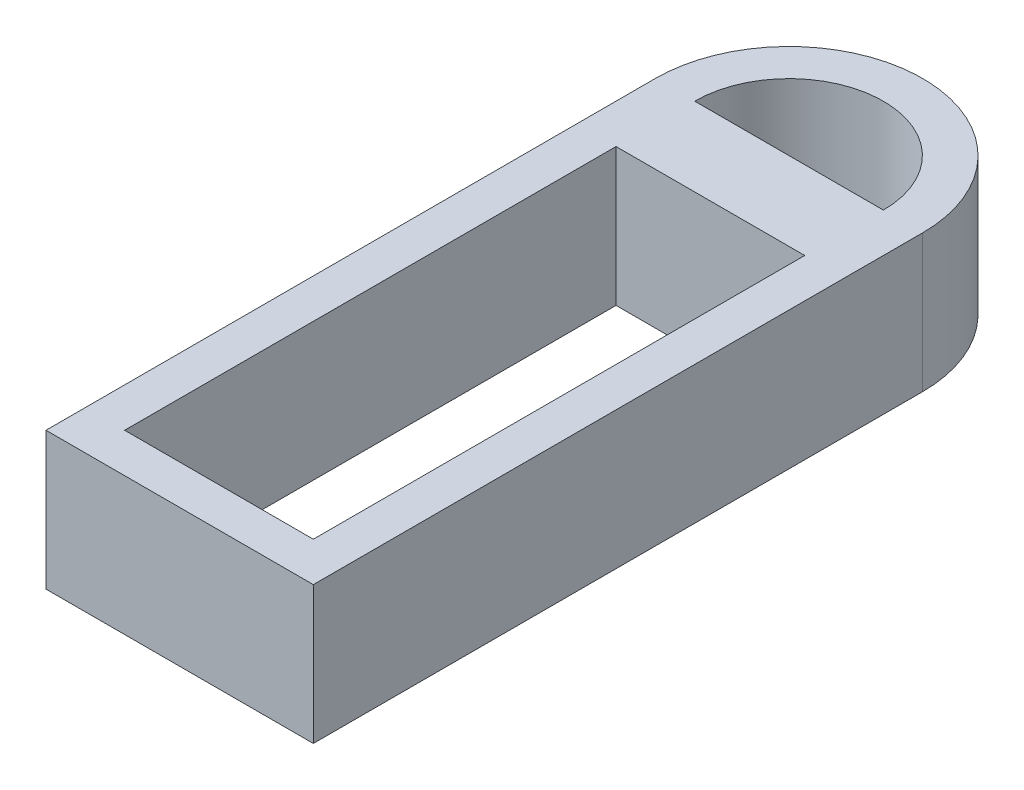
ISO-10303-21;
HEADER;
FILE_DESCRIPTION(('STEP AP214'),'2;1');
FILE_NAME('part.step','',(''),(''),'','','');
FILE_SCHEMA(('AUTOMOTIVE_DESIGN { 1 0 10303 214 1 1 1 1 }'));
ENDSEC;
DATA;
#1=APPLICATION_CONTEXT('core data for automotive mechanical design processes');
#2=APPLICATION_PROTOCOL_DEFINITION('international standard','automotive_design',2000,#1);
#3=PRODUCT_CONTEXT('',#1,'mechanical');
#4=PRODUCT('Part','Part','',(#3));
#5=PRODUCT_RELATED_PRODUCT_CATEGORY('part','',(#4));
#6=PRODUCT_DEFINITION_FORMATION('','',#4);
#7=PRODUCT_DEFINITION_CONTEXT('part definition',#1,'design');
#8=PRODUCT_DEFINITION('design','',#6,#7);
#9=PRODUCT_DEFINITION_SHAPE('','',#8);
#10=(LENGTH_UNIT() NAMED_UNIT(*) SI_UNIT(.MILLI.,.METRE.));
#11=(NAMED_UNIT(*) PLANE_ANGLE_UNIT() SI_UNIT($,.RADIAN.));
#12=(NAMED_UNIT(*) SI_UNIT($,.STERADIAN.) SOLID_ANGLE_UNIT());
#13=UNCERTAINTY_MEASURE_WITH_UNIT(LENGTH_MEASURE(1.E-05),#10,'distance_accuracy_value','');
#14=(GEOMETRIC_REPRESENTATION_CONTEXT(3) GLOBAL_UNCERTAINTY_ASSIGNED_CONTEXT((#13)) GLOBAL_UNIT_ASSIGNED_CONTEXT((#10,
#11,#12)) REPRESENTATION_CONTEXT('',''));
#15=CARTESIAN_POINT('',(0.,0.,0.));
#16=DIRECTION('',(0.,0.,1.));
#17=DIRECTION('',(1.,0.,0.));
#18=AXIS2_PLACEMENT_3D('',#15,#16,#17);
#19=CARTESIAN_POINT('',(0.,3.5,0.));
#20=DIRECTION('',(0.,-1.,0.));
#21=DIRECTION('',(0.,0.,-1.));
#22=AXIS2_PLACEMENT_3D('',#19,#20,#21);
#23=PLANE('',#22);
#24=DIRECTION('',(0.,0.,1.));
#25=VECTOR('',#24,1.);
#26=CARTESIAN_POINT('',(-3.4,3.5,7.25));
#27=LINE('',#26,#25);
#28=CARTESIAN_POINT('',(-3.4,3.5,-8.25));
#29=VERTEX_POINT('',#28);
#30=CARTESIAN_POINT('',(-3.4,3.5,7.25));
#31=VERTEX_POINT('',#30);
#32=EDGE_CURVE('E174',#29,#31,#27,.T.);
#33=ORIENTED_EDGE('',*,*,#32,.T.);
#34=DIRECTION('',(1.,0.,0.));
#35=VECTOR('',#34,1.);
#36=CARTESIAN_POINT('',(-3.4,3.5,7.25));
#37=LINE('',#36,#35);
#38=CARTESIAN_POINT('',(3.4,3.5,7.25));
#39=VERTEX_POINT('',#38);
#40=EDGE_CURVE('E177',#31,#39,#37,.T.);
#41=ORIENTED_EDGE('',*,*,#40,.T.);
#42=DIRECTION('',(0.,0.,-1.));
#43=VECTOR('',#42,1.);
#44=CARTESIAN_POINT('',(3.4,3.5,7.25));
#45=LINE('',#44,#43);
#46=CARTESIAN_POINT('',(3.4,3.5,-8.25));
#47=VERTEX_POINT('',#46);
#48=EDGE_CURVE('E180',#39,#47,#45,.T.);
#49=ORIENTED_EDGE('',*,*,#48,.T.);
#50=CARTESIAN_POINT('',(0.,3.5,-8.25));
#51=DIRECTION('',(0.,1.,0.));
#52=DIRECTION('',(0.,0.,-1.));
#53=AXIS2_PLACEMENT_3D('',#50,#51,#52);
#54=CIRCLE('',#53,3.4);
#55=EDGE_CURVE('E135',#47,#29,#54,.T.);
#56=ORIENTED_EDGE('',*,*,#55,.T.);
#57=EDGE_LOOP('',(#33,#41,#49,#56));
#58=FACE_BOUND('',#57,.T.);
#59=DIRECTION('',(0.,0.,-1.));
#60=VECTOR('',#59,1.);
#61=CARTESIAN_POINT('',(2.4,3.5,6.25));
#62=LINE('',#61,#60);
#63=CARTESIAN_POINT('',(2.4,3.5,6.25));
#64=VERTEX_POINT('',#63);
#65=CARTESIAN_POINT('',(2.4,3.5,-6.25));
#66=VERTEX_POINT('',#65);
#67=EDGE_CURVE('E148',#64,#66,#62,.T.);
#68=ORIENTED_EDGE('',*,*,#67,.F.);
#69=DIRECTION('',(1.,0.,0.));
#70=VECTOR('',#69,1.);
#71=CARTESIAN_POINT('',(-2.4,3.5,6.25));
#72=LINE('',#71,#70);
#73=CARTESIAN_POINT('',(-2.4,3.5,6.25));
#74=VERTEX_POINT('',#73);
#75=EDGE_CURVE('E155',#74,#64,#72,.T.);
#76=ORIENTED_EDGE('',*,*,#75,.F.);
#77=DIRECTION('',(0.,0.,1.));
#78=VECTOR('',#77,1.);
#79=CARTESIAN_POINT('',(-2.4,3.5,6.25));
#80=LINE('',#79,#78);
#81=CARTESIAN_POINT('',(-2.4,3.5,-6.25));
#82=VERTEX_POINT('',#81);
#83=EDGE_CURVE('E153',#82,#74,#80,.T.);
#84=ORIENTED_EDGE('',*,*,#83,.F.);
#85=DIRECTION('',(-1.,0.,0.));
#86=VECTOR('',#85,1.);
#87=CARTESIAN_POINT('',(-2.4,3.5,-6.25));
#88=LINE('',#87,#86);
#89=EDGE_CURVE('E150',#66,#82,#88,.T.);
#90=ORIENTED_EDGE('',*,*,#89,.F.);
#91=EDGE_LOOP('',(#68,#76,#84,#90));
#92=FACE_BOUND('',#91,.T.);
#93=DIRECTION('',(1.,0.,0.));
#94=VECTOR('',#93,1.);
#95=CARTESIAN_POINT('',(-2.4,3.5,-8.25));
#96=LINE('',#95,#94);
#97=CARTESIAN_POINT('',(-2.4,3.5,-8.25));
#98=VERTEX_POINT('',#97);
#99=CARTESIAN_POINT('',(2.4,3.5,-8.25));
#100=VERTEX_POINT('',#99);
#101=EDGE_CURVE('E130',#98,#100,#96,.T.);
#102=ORIENTED_EDGE('',*,*,#101,.F.);
#103=CARTESIAN_POINT('',(0.,3.5,-8.25));
#104=DIRECTION('',(0.,1.,0.));
#105=DIRECTION('',(0.,0.,-1.));
#106=AXIS2_PLACEMENT_3D('',#103,#104,#105);
#107=CIRCLE('',#106,2.4);
#108=EDGE_CURVE('E118',#100,#98,#107,.T.);
#109=ORIENTED_EDGE('',*,*,#108,.F.);
#110=EDGE_LOOP('',(#102,#109));
#111=FACE_BOUND('',#110,.T.);
#112=ADVANCED_FACE('F33',(#58,#92,#111),#23,.F.);
#113=CARTESIAN_POINT('',(0.,0.,0.));
#114=DIRECTION('',(0.,-1.,0.));
#115=DIRECTION('',(0.,0.,-1.));
#116=AXIS2_PLACEMENT_3D('',#113,#114,#115);
#117=PLANE('',#116);
#118=DIRECTION('',(0.,0.,1.));
#119=VECTOR('',#118,1.);
#120=CARTESIAN_POINT('',(-3.4,0.,7.25));
#121=LINE('',#120,#119);
#122=CARTESIAN_POINT('',(-3.4,0.,-8.25));
#123=VERTEX_POINT('',#122);
#124=CARTESIAN_POINT('',(-3.4,0.,7.25));
#125=VERTEX_POINT('',#124);
#126=EDGE_CURVE('E173',#123,#125,#121,.T.);
#127=ORIENTED_EDGE('',*,*,#126,.F.);
#128=CARTESIAN_POINT('',(0.,0.,-8.25));
#129=DIRECTION('',(0.,1.,0.));
#130=DIRECTION('',(0.,0.,-1.));
#131=AXIS2_PLACEMENT_3D('',#128,#129,#130);
#132=CIRCLE('',#131,3.4);
#133=CARTESIAN_POINT('',(3.4,0.,-8.25));
#134=VERTEX_POINT('',#133);
#135=EDGE_CURVE('E137',#134,#123,#132,.T.);
#136=ORIENTED_EDGE('',*,*,#135,.F.);
#137=DIRECTION('',(0.,0.,-1.));
#138=VECTOR('',#137,1.);
#139=CARTESIAN_POINT('',(3.4,0.,7.25));
#140=LINE('',#139,#138);
#141=CARTESIAN_POINT('',(3.4,0.,7.25));
#142=VERTEX_POINT('',#141);
#143=EDGE_CURVE('E178',#142,#134,#140,.T.);
#144=ORIENTED_EDGE('',*,*,#143,.F.);
#145=DIRECTION('',(1.,0.,0.));
#146=VECTOR('',#145,1.);
#147=CARTESIAN_POINT('',(-3.4,0.,7.25));
#148=LINE('',#147,#146);
#149=EDGE_CURVE('E184',#125,#142,#148,.T.);
#150=ORIENTED_EDGE('',*,*,#149,.F.);
#151=EDGE_LOOP('',(#127,#136,#144,#150));
#152=FACE_BOUND('',#151,.T.);
#153=DIRECTION('',(1.,0.,0.));
#154=VECTOR('',#153,1.);
#155=CARTESIAN_POINT('',(-2.4,0.,6.25));
#156=LINE('',#155,#154);
#157=CARTESIAN_POINT('',(-2.4,0.,6.25));
#158=VERTEX_POINT('',#157);
#159=CARTESIAN_POINT('',(2.4,0.,6.25));
#160=VERTEX_POINT('',#159);
#161=EDGE_CURVE('E151',#158,#160,#156,.T.);
#162=ORIENTED_EDGE('',*,*,#161,.T.);
#163=DIRECTION('',(0.,0.,-1.));
#164=VECTOR('',#163,1.);
#165=CARTESIAN_POINT('',(2.4,0.,6.25));
#166=LINE('',#165,#164);
#167=CARTESIAN_POINT('',(2.4,0.,-6.25));
#168=VERTEX_POINT('',#167);
#169=EDGE_CURVE('E56',#160,#168,#166,.T.);
#170=ORIENTED_EDGE('',*,*,#169,.T.);
#171=DIRECTION('',(-1.,0.,0.));
#172=VECTOR('',#171,1.);
#173=CARTESIAN_POINT('',(-2.4,0.,-6.25));
#174=LINE('',#173,#172);
#175=CARTESIAN_POINT('',(-2.4,0.,-6.25));
#176=VERTEX_POINT('',#175);
#177=EDGE_CURVE('E159',#168,#176,#174,.T.);
#178=ORIENTED_EDGE('',*,*,#177,.T.);
#179=DIRECTION('',(0.,0.,1.));
#180=VECTOR('',#179,1.);
#181=CARTESIAN_POINT('',(-2.4,0.,6.25));
#182=LINE('',#181,#180);
#183=EDGE_CURVE('E162',#176,#158,#182,.T.);
#184=ORIENTED_EDGE('',*,*,#183,.T.);
#185=EDGE_LOOP('',(#162,#170,#178,#184));
#186=FACE_BOUND('',#185,.T.);
#187=CARTESIAN_POINT('',(0.,0.,-8.25));
#188=DIRECTION('',(0.,1.,0.));
#189=DIRECTION('',(0.,0.,-1.));
#190=AXIS2_PLACEMENT_3D('',#187,#188,#189);
#191=CIRCLE('',#190,2.4);
#192=CARTESIAN_POINT('',(2.4,0.,-8.25));
#193=VERTEX_POINT('',#192);
#194=CARTESIAN_POINT('',(-2.4,0.,-8.25));
#195=VERTEX_POINT('',#194);
#196=EDGE_CURVE('E115',#193,#195,#191,.T.);
#197=ORIENTED_EDGE('',*,*,#196,.T.);
#198=DIRECTION('',(1.,0.,0.));
#199=VECTOR('',#198,1.);
#200=CARTESIAN_POINT('',(-2.4,0.,-8.25));
#201=LINE('',#200,#199);
#202=EDGE_CURVE('E123',#195,#193,#201,.T.);
#203=ORIENTED_EDGE('',*,*,#202,.T.);
#204=EDGE_LOOP('',(#197,#203));
#205=FACE_BOUND('',#204,.T.);
#206=ADVANCED_FACE('F129',(#152,#186,#205),#117,.T.);
#207=CARTESIAN_POINT('',(-3.4,3.5,7.25));
#208=DIRECTION('',(1.,0.,0.));
#209=DIRECTION('',(0.,0.,-1.));
#210=AXIS2_PLACEMENT_3D('',#207,#208,#209);
#211=PLANE('',#210);
#212=ORIENTED_EDGE('',*,*,#126,.T.);
#213=DIRECTION('',(0.,-1.,0.));
#214=VECTOR('',#213,1.);
#215=CARTESIAN_POINT('',(-3.4,3.5,7.25));
#216=LINE('',#215,#214);
#217=EDGE_CURVE('E11',#31,#125,#216,.T.);
#218=ORIENTED_EDGE('',*,*,#217,.F.);
#219=ORIENTED_EDGE('',*,*,#32,.F.);
#220=DIRECTION('',(0.,1.,0.));
#221=VECTOR('',#220,1.);
#222=CARTESIAN_POINT('',(-3.4,0.,-8.25));
#223=LINE('',#222,#221);
#224=EDGE_CURVE('E143',#123,#29,#223,.T.);
#225=ORIENTED_EDGE('',*,*,#224,.F.);
#226=EDGE_LOOP('',(#212,#218,#219,#225));
#227=FACE_BOUND('',#226,.T.);
#228=ADVANCED_FACE('F35',(#227),#211,.F.);
#229=CARTESIAN_POINT('',(-3.4,3.5,7.25));
#230=DIRECTION('',(0.,0.,-1.));
#231=DIRECTION('',(-1.,0.,0.));
#232=AXIS2_PLACEMENT_3D('',#229,#230,#231);
#233=PLANE('',#232);
#234=ORIENTED_EDGE('',*,*,#149,.T.);
#235=DIRECTION('',(0.,-1.,0.));
#236=VECTOR('',#235,1.);
#237=CARTESIAN_POINT('',(3.4,3.5,7.25));
#238=LINE('',#237,#236);
#239=EDGE_CURVE('E41',#39,#142,#238,.T.);
#240=ORIENTED_EDGE('',*,*,#239,.F.);
#241=ORIENTED_EDGE('',*,*,#40,.F.);
#242=ORIENTED_EDGE('',*,*,#217,.T.);
#243=EDGE_LOOP('',(#234,#240,#241,#242));
#244=FACE_BOUND('',#243,.T.);
#245=ADVANCED_FACE('F204',(#244),#233,.F.);
#246=CARTESIAN_POINT('',(3.4,3.5,7.25));
#247=DIRECTION('',(-1.,0.,0.));
#248=DIRECTION('',(0.,0.,1.));
#249=AXIS2_PLACEMENT_3D('',#246,#247,#248);
#250=PLANE('',#249);
#251=ORIENTED_EDGE('',*,*,#143,.T.);
#252=DIRECTION('',(0.,1.,0.));
#253=VECTOR('',#252,1.);
#254=CARTESIAN_POINT('',(3.4,0.,-8.25));
#255=LINE('',#254,#253);
#256=EDGE_CURVE('E140',#134,#47,#255,.T.);
#257=ORIENTED_EDGE('',*,*,#256,.T.);
#258=ORIENTED_EDGE('',*,*,#48,.F.);
#259=ORIENTED_EDGE('',*,*,#239,.T.);
#260=EDGE_LOOP('',(#251,#257,#258,#259));
#261=FACE_BOUND('',#260,.T.);
#262=ADVANCED_FACE('F191',(#261),#250,.F.);
#263=CARTESIAN_POINT('',(2.4,3.5,6.25));
#264=DIRECTION('',(-1.,0.,0.));
#265=DIRECTION('',(0.,0.,1.));
#266=AXIS2_PLACEMENT_3D('',#263,#264,#265);
#267=PLANE('',#266);
#268=ORIENTED_EDGE('',*,*,#169,.F.);
#269=DIRECTION('',(0.,-1.,0.));
#270=VECTOR('',#269,1.);
#271=CARTESIAN_POINT('',(2.4,3.5,6.25));
#272=LINE('',#271,#270);
#273=EDGE_CURVE('E157',#64,#160,#272,.T.);
#274=ORIENTED_EDGE('',*,*,#273,.F.);
#275=ORIENTED_EDGE('',*,*,#67,.T.);
#276=DIRECTION('',(0.,-1.,0.));
#277=VECTOR('',#276,1.);
#278=CARTESIAN_POINT('',(2.4,3.5,-6.25));
#279=LINE('',#278,#277);
#280=EDGE_CURVE('E171',#66,#168,#279,.T.);
#281=ORIENTED_EDGE('',*,*,#280,.T.);
#282=EDGE_LOOP('',(#268,#274,#275,#281));
#283=FACE_BOUND('',#282,.T.);
#284=ADVANCED_FACE('F217',(#283),#267,.T.);
#285=CARTESIAN_POINT('',(-2.4,3.5,-6.25));
#286=DIRECTION('',(0.,0.,1.));
#287=DIRECTION('',(1.,0.,0.));
#288=AXIS2_PLACEMENT_3D('',#285,#286,#287);
#289=PLANE('',#288);
#290=ORIENTED_EDGE('',*,*,#177,.F.);
#291=ORIENTED_EDGE('',*,*,#280,.F.);
#292=ORIENTED_EDGE('',*,*,#89,.T.);
#293=DIRECTION('',(0.,-1.,0.));
#294=VECTOR('',#293,1.);
#295=CARTESIAN_POINT('',(-2.4,3.5,-6.25));
#296=LINE('',#295,#294);
#297=EDGE_CURVE('E169',#82,#176,#296,.T.);
#298=ORIENTED_EDGE('',*,*,#297,.T.);
#299=EDGE_LOOP('',(#290,#291,#292,#298));
#300=FACE_BOUND('',#299,.T.);
#301=ADVANCED_FACE('F224',(#300),#289,.T.);
#302=CARTESIAN_POINT('',(-2.4,3.5,6.25));
#303=DIRECTION('',(1.,0.,0.));
#304=DIRECTION('',(0.,0.,-1.));
#305=AXIS2_PLACEMENT_3D('',#302,#303,#304);
#306=PLANE('',#305);
#307=ORIENTED_EDGE('',*,*,#183,.F.);
#308=ORIENTED_EDGE('',*,*,#297,.F.);
#309=ORIENTED_EDGE('',*,*,#83,.T.);
#310=DIRECTION('',(0.,-1.,0.));
#311=VECTOR('',#310,1.);
#312=CARTESIAN_POINT('',(-2.4,3.5,6.25));
#313=LINE('',#312,#311);
#314=EDGE_CURVE('E48',#74,#158,#313,.T.);
#315=ORIENTED_EDGE('',*,*,#314,.T.);
#316=EDGE_LOOP('',(#307,#308,#309,#315));
#317=FACE_BOUND('',#316,.T.);
#318=ADVANCED_FACE('F228',(#317),#306,.T.);
#319=CARTESIAN_POINT('',(-2.4,3.5,6.25));
#320=DIRECTION('',(0.,0.,-1.));
#321=DIRECTION('',(-1.,0.,0.));
#322=AXIS2_PLACEMENT_3D('',#319,#320,#321);
#323=PLANE('',#322);
#324=ORIENTED_EDGE('',*,*,#161,.F.);
#325=ORIENTED_EDGE('',*,*,#314,.F.);
#326=ORIENTED_EDGE('',*,*,#75,.T.);
#327=ORIENTED_EDGE('',*,*,#273,.T.);
#328=EDGE_LOOP('',(#324,#325,#326,#327));
#329=FACE_BOUND('',#328,.T.);
#330=ADVANCED_FACE('F233',(#329),#323,.T.);
#331=CARTESIAN_POINT('',(0.,0.,-8.25));
#332=DIRECTION('',(0.,1.,0.));
#333=DIRECTION('',(0.,0.,1.));
#334=AXIS2_PLACEMENT_3D('',#331,#332,#333);
#335=CYLINDRICAL_SURFACE('',#334,3.4);
#336=ORIENTED_EDGE('',*,*,#55,.F.);
#337=ORIENTED_EDGE('',*,*,#256,.F.);
#338=ORIENTED_EDGE('',*,*,#135,.T.);
#339=ORIENTED_EDGE('',*,*,#224,.T.);
#340=EDGE_LOOP('',(#336,#337,#338,#339));
#341=FACE_BOUND('',#340,.T.);
#342=ADVANCED_FACE('F200',(#341),#335,.T.);
#343=CARTESIAN_POINT('',(0.,0.,-8.25));
#344=DIRECTION('',(0.,1.,0.));
#345=DIRECTION('',(0.,0.,1.));
#346=AXIS2_PLACEMENT_3D('',#343,#344,#345);
#347=CYLINDRICAL_SURFACE('',#346,2.4);
#348=ORIENTED_EDGE('',*,*,#108,.T.);
#349=DIRECTION('',(0.,1.,0.));
#350=VECTOR('',#349,1.);
#351=CARTESIAN_POINT('',(-2.4,0.,-8.25));
#352=LINE('',#351,#350);
#353=EDGE_CURVE('E111',#195,#98,#352,.T.);
#354=ORIENTED_EDGE('',*,*,#353,.F.);
#355=ORIENTED_EDGE('',*,*,#196,.F.);
#356=DIRECTION('',(0.,1.,0.));
#357=VECTOR('',#356,1.);
#358=CARTESIAN_POINT('',(2.4,0.,-8.25));
#359=LINE('',#358,#357);
#360=EDGE_CURVE('E122',#193,#100,#359,.T.);
#361=ORIENTED_EDGE('',*,*,#360,.T.);
#362=EDGE_LOOP('',(#348,#354,#355,#361));
#363=FACE_BOUND('',#362,.T.);
#364=ADVANCED_FACE('F113',(#363),#347,.F.);
#365=CARTESIAN_POINT('',(-2.4,0.,-8.25));
#366=DIRECTION('',(0.,0.,1.));
#367=DIRECTION('',(1.,0.,0.));
#368=AXIS2_PLACEMENT_3D('',#365,#366,#367);
#369=PLANE('',#368);
#370=ORIENTED_EDGE('',*,*,#101,.T.);
#371=ORIENTED_EDGE('',*,*,#360,.F.);
#372=ORIENTED_EDGE('',*,*,#202,.F.);
#373=ORIENTED_EDGE('',*,*,#353,.T.);
#374=EDGE_LOOP('',(#370,#371,#372,#373));
#375=FACE_BOUND('',#374,.T.);
#376=ADVANCED_FACE('F126',(#375),#369,.F.);
#377=CLOSED_SHELL('',(#112,#206,#228,#245,#262,#284,#301,#318,#330,#342,#364,#376));
#378=MANIFOLD_SOLID_BREP('B2',#377);
#379=ADVANCED_BREP_SHAPE_REPRESENTATION('',(#18,#378),#14);
#380=SHAPE_DEFINITION_REPRESENTATION(#9,#379);
ENDSEC;
END-ISO-10303-21;
